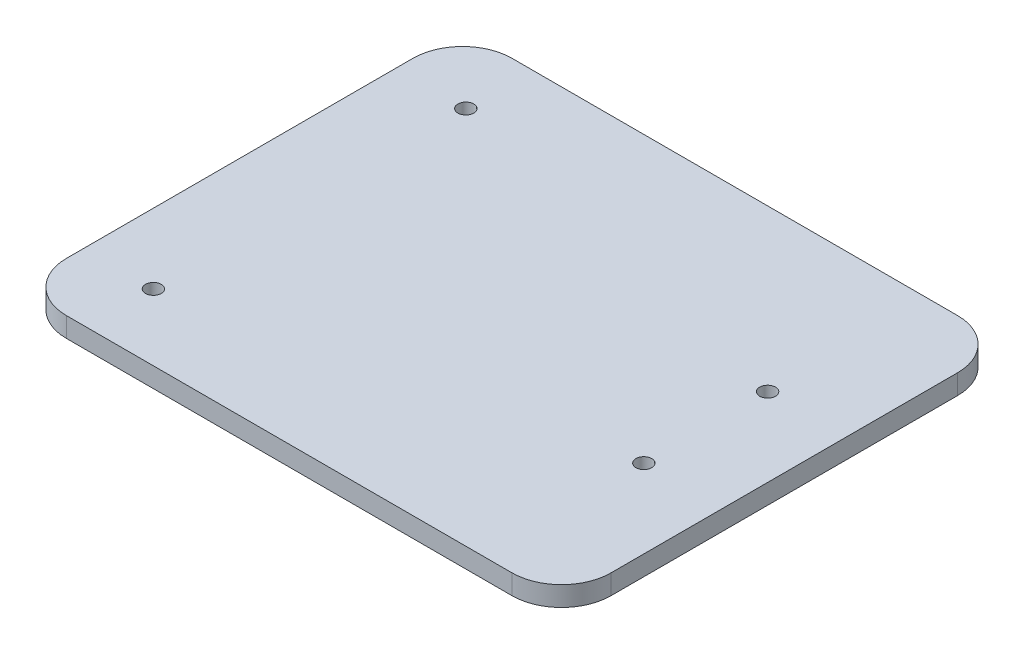
ISO-10303-21;
HEADER;
FILE_DESCRIPTION(('STEP AP214'),'2;1');
FILE_NAME('part.step','',(''),(''),'','','');
FILE_SCHEMA(('AUTOMOTIVE_DESIGN { 1 0 10303 214 1 1 1 1 }'));
ENDSEC;
DATA;
#1=APPLICATION_CONTEXT('core data for automotive mechanical design processes');
#2=APPLICATION_PROTOCOL_DEFINITION('international standard','automotive_design',2000,#1);
#3=PRODUCT_CONTEXT('',#1,'mechanical');
#4=PRODUCT('Part','Part','',(#3));
#5=PRODUCT_RELATED_PRODUCT_CATEGORY('part','',(#4));
#6=PRODUCT_DEFINITION_FORMATION('','',#4);
#7=PRODUCT_DEFINITION_CONTEXT('part definition',#1,'design');
#8=PRODUCT_DEFINITION('design','',#6,#7);
#9=PRODUCT_DEFINITION_SHAPE('','',#8);
#10=(LENGTH_UNIT() NAMED_UNIT(*) SI_UNIT(.MILLI.,.METRE.));
#11=(NAMED_UNIT(*) PLANE_ANGLE_UNIT() SI_UNIT($,.RADIAN.));
#12=(NAMED_UNIT(*) SI_UNIT($,.STERADIAN.) SOLID_ANGLE_UNIT());
#13=UNCERTAINTY_MEASURE_WITH_UNIT(LENGTH_MEASURE(1.E-05),#10,'distance_accuracy_value','');
#14=(GEOMETRIC_REPRESENTATION_CONTEXT(3) GLOBAL_UNCERTAINTY_ASSIGNED_CONTEXT((#13)) GLOBAL_UNIT_ASSIGNED_CONTEXT((#10,
#11,#12)) REPRESENTATION_CONTEXT('',''));
#15=CARTESIAN_POINT('',(0.,0.,0.));
#16=DIRECTION('',(0.,0.,1.));
#17=DIRECTION('',(1.,0.,0.));
#18=AXIS2_PLACEMENT_3D('',#15,#16,#17);
#19=CARTESIAN_POINT('',(-37.6983852204907,4.,-37.135142537582));
#20=DIRECTION('',(1.,0.,0.));
#21=DIRECTION('',(0.,0.,-1.));
#22=AXIS2_PLACEMENT_3D('',#19,#20,#21);
#23=PLANE('',#22);
#24=DIRECTION('',(0.,0.,1.));
#25=VECTOR('',#24,1.);
#26=CARTESIAN_POINT('',(-37.6983852204907,4.,-37.135142537582));
#27=LINE('',#26,#25);
#28=CARTESIAN_POINT('',(-37.6983852204907,4.,-27.135142537582));
#29=VERTEX_POINT('',#28);
#30=CARTESIAN_POINT('',(-37.6983852204907,4.,42.8648574624179));
#31=VERTEX_POINT('',#30);
#32=EDGE_CURVE('E122',#29,#31,#27,.T.);
#33=ORIENTED_EDGE('',*,*,#32,.F.);
#34=DIRECTION('',(0.,-1.,0.));
#35=VECTOR('',#34,1.);
#36=CARTESIAN_POINT('',(-37.6983852204907,4.,-27.135142537582));
#37=LINE('',#36,#35);
#38=CARTESIAN_POINT('',(-37.6983852204907,0.,-27.135142537582));
#39=VERTEX_POINT('',#38);
#40=EDGE_CURVE('E107',#29,#39,#37,.T.);
#41=ORIENTED_EDGE('',*,*,#40,.T.);
#42=DIRECTION('',(0.,0.,1.));
#43=VECTOR('',#42,1.);
#44=CARTESIAN_POINT('',(-37.6983852204907,0.,-37.135142537582));
#45=LINE('',#44,#43);
#46=CARTESIAN_POINT('',(-37.6983852204907,0.,42.8648574624179));
#47=VERTEX_POINT('',#46);
#48=EDGE_CURVE('E119',#39,#47,#45,.T.);
#49=ORIENTED_EDGE('',*,*,#48,.T.);
#50=DIRECTION('',(0.,-1.,0.));
#51=VECTOR('',#50,1.);
#52=CARTESIAN_POINT('',(-37.6983852204907,4.,42.8648574624179));
#53=LINE('',#52,#51);
#54=EDGE_CURVE('E124',#47,#31,#53,.F.);
#55=ORIENTED_EDGE('',*,*,#54,.T.);
#56=EDGE_LOOP('',(#33,#41,#49,#55));
#57=FACE_BOUND('',#56,.T.);
#58=ADVANCED_FACE('F37',(#57),#23,.F.);
#59=CARTESIAN_POINT('',(-37.6983852204907,4.,52.8648574624179));
#60=DIRECTION('',(0.,0.,-1.));
#61=DIRECTION('',(-1.,0.,0.));
#62=AXIS2_PLACEMENT_3D('',#59,#60,#61);
#63=PLANE('',#62);
#64=DIRECTION('',(1.,0.,0.));
#65=VECTOR('',#64,1.);
#66=CARTESIAN_POINT('',(-37.6983852204907,0.,52.8648574624179));
#67=LINE('',#66,#65);
#68=CARTESIAN_POINT('',(-27.6983852204907,0.,52.8648574624179));
#69=VERTEX_POINT('',#68);
#70=CARTESIAN_POINT('',(62.3016147795094,0.,52.8648574624179));
#71=VERTEX_POINT('',#70);
#72=EDGE_CURVE('E128',#69,#71,#67,.T.);
#73=ORIENTED_EDGE('',*,*,#72,.T.);
#74=DIRECTION('',(0.,-1.,0.));
#75=VECTOR('',#74,1.);
#76=CARTESIAN_POINT('',(62.3016147795094,4.,52.8648574624179));
#77=LINE('',#76,#75);
#78=CARTESIAN_POINT('',(62.3016147795094,4.,52.8648574624179));
#79=VERTEX_POINT('',#78);
#80=EDGE_CURVE('E11',#71,#79,#77,.F.);
#81=ORIENTED_EDGE('',*,*,#80,.T.);
#82=DIRECTION('',(1.,0.,0.));
#83=VECTOR('',#82,1.);
#84=CARTESIAN_POINT('',(-37.6983852204907,4.,52.8648574624179));
#85=LINE('',#84,#83);
#86=CARTESIAN_POINT('',(-27.6983852204907,4.,52.8648574624179));
#87=VERTEX_POINT('',#86);
#88=EDGE_CURVE('E168',#87,#79,#85,.T.);
#89=ORIENTED_EDGE('',*,*,#88,.F.);
#90=DIRECTION('',(0.,-1.,0.));
#91=VECTOR('',#90,1.);
#92=CARTESIAN_POINT('',(-27.6983852204907,4.,52.8648574624179));
#93=LINE('',#92,#91);
#94=EDGE_CURVE('E45',#87,#69,#93,.T.);
#95=ORIENTED_EDGE('',*,*,#94,.T.);
#96=EDGE_LOOP('',(#73,#81,#89,#95));
#97=FACE_BOUND('',#96,.T.);
#98=ADVANCED_FACE('F166',(#97),#63,.F.);
#99=CARTESIAN_POINT('',(72.3016147795093,4.,-37.135142537582));
#100=DIRECTION('',(-1.,0.,0.));
#101=DIRECTION('',(0.,0.,1.));
#102=AXIS2_PLACEMENT_3D('',#99,#100,#101);
#103=PLANE('',#102);
#104=DIRECTION('',(0.,0.,-1.));
#105=VECTOR('',#104,1.);
#106=CARTESIAN_POINT('',(72.3016147795093,0.,-37.135142537582));
#107=LINE('',#106,#105);
#108=CARTESIAN_POINT('',(72.3016147795094,0.,42.8648574624179));
#109=VERTEX_POINT('',#108);
#110=CARTESIAN_POINT('',(72.3016147795093,0.,-27.1351425375821));
#111=VERTEX_POINT('',#110);
#112=EDGE_CURVE('E132',#109,#111,#107,.T.);
#113=ORIENTED_EDGE('',*,*,#112,.T.);
#114=DIRECTION('',(0.,-1.,0.));
#115=VECTOR('',#114,1.);
#116=CARTESIAN_POINT('',(72.3016147795093,4.,-27.1351425375821));
#117=LINE('',#116,#115);
#118=CARTESIAN_POINT('',(72.3016147795093,4.,-27.1351425375821));
#119=VERTEX_POINT('',#118);
#120=EDGE_CURVE('E52',#111,#119,#117,.F.);
#121=ORIENTED_EDGE('',*,*,#120,.T.);
#122=DIRECTION('',(0.,0.,-1.));
#123=VECTOR('',#122,1.);
#124=CARTESIAN_POINT('',(72.3016147795093,4.,-37.135142537582));
#125=LINE('',#124,#123);
#126=CARTESIAN_POINT('',(72.3016147795094,4.,42.8648574624179));
#127=VERTEX_POINT('',#126);
#128=EDGE_CURVE('E176',#127,#119,#125,.T.);
#129=ORIENTED_EDGE('',*,*,#128,.F.);
#130=DIRECTION('',(0.,-1.,0.));
#131=VECTOR('',#130,1.);
#132=CARTESIAN_POINT('',(72.3016147795094,4.,42.8648574624179));
#133=LINE('',#132,#131);
#134=EDGE_CURVE('E159',#127,#109,#133,.T.);
#135=ORIENTED_EDGE('',*,*,#134,.T.);
#136=EDGE_LOOP('',(#113,#121,#129,#135));
#137=FACE_BOUND('',#136,.T.);
#138=ADVANCED_FACE('F175',(#137),#103,.F.);
#139=CARTESIAN_POINT('',(-37.6983852204907,4.,-37.135142537582));
#140=DIRECTION('',(0.,0.,1.));
#141=DIRECTION('',(1.,0.,0.));
#142=AXIS2_PLACEMENT_3D('',#139,#140,#141);
#143=PLANE('',#142);
#144=DIRECTION('',(-1.,0.,0.));
#145=VECTOR('',#144,1.);
#146=CARTESIAN_POINT('',(-37.6983852204907,0.,-37.135142537582));
#147=LINE('',#146,#145);
#148=CARTESIAN_POINT('',(62.3016147795093,0.,-37.135142537582));
#149=VERTEX_POINT('',#148);
#150=CARTESIAN_POINT('',(-27.6983852204907,0.,-37.135142537582));
#151=VERTEX_POINT('',#150);
#152=EDGE_CURVE('E142',#149,#151,#147,.T.);
#153=ORIENTED_EDGE('',*,*,#152,.T.);
#154=DIRECTION('',(0.,-1.,0.));
#155=VECTOR('',#154,1.);
#156=CARTESIAN_POINT('',(-27.6983852204907,4.,-37.135142537582));
#157=LINE('',#156,#155);
#158=CARTESIAN_POINT('',(-27.6983852204907,4.,-37.135142537582));
#159=VERTEX_POINT('',#158);
#160=EDGE_CURVE('E108',#151,#159,#157,.F.);
#161=ORIENTED_EDGE('',*,*,#160,.T.);
#162=DIRECTION('',(-1.,0.,0.));
#163=VECTOR('',#162,1.);
#164=CARTESIAN_POINT('',(-37.6983852204907,4.,-37.135142537582));
#165=LINE('',#164,#163);
#166=CARTESIAN_POINT('',(62.3016147795093,4.,-37.135142537582));
#167=VERTEX_POINT('',#166);
#168=EDGE_CURVE('E138',#167,#159,#165,.T.);
#169=ORIENTED_EDGE('',*,*,#168,.F.);
#170=DIRECTION('',(0.,-1.,0.));
#171=VECTOR('',#170,1.);
#172=CARTESIAN_POINT('',(62.3016147795093,4.,-37.135142537582));
#173=LINE('',#172,#171);
#174=EDGE_CURVE('E113',#167,#149,#173,.T.);
#175=ORIENTED_EDGE('',*,*,#174,.T.);
#176=EDGE_LOOP('',(#153,#161,#169,#175));
#177=FACE_BOUND('',#176,.T.);
#178=ADVANCED_FACE('F208',(#177),#143,.F.);
#179=CARTESIAN_POINT('',(0.,4.,0.));
#180=DIRECTION('',(0.,1.,0.));
#181=DIRECTION('',(0.,0.,1.));
#182=AXIS2_PLACEMENT_3D('',#179,#180,#181);
#183=PLANE('',#182);
#184=CARTESIAN_POINT('',(-23.5738514825679,4.,-23.6851425375821));
#185=DIRECTION('',(0.,1.,0.));
#186=DIRECTION('',(0.,0.,1.));
#187=AXIS2_PLACEMENT_3D('',#184,#185,#186);
#188=CIRCLE('',#187,1.6);
#189=CARTESIAN_POINT('',(-23.5738514825679,4.,-22.0851425375821));
#190=VERTEX_POINT('',#189);
#191=EDGE_CURVE('E135',#190,#190,#188,.T.);
#192=ORIENTED_EDGE('',*,*,#191,.F.);
#193=EDGE_LOOP('',(#192));
#194=FACE_BOUND('',#193,.T.);
#195=CARTESIAN_POINT('',(56.4261485174321,4.,-4.63514253758207));
#196=DIRECTION('',(0.,1.,0.));
#197=DIRECTION('',(0.,0.,1.));
#198=AXIS2_PLACEMENT_3D('',#195,#196,#197);
#199=CIRCLE('',#198,1.6);
#200=CARTESIAN_POINT('',(56.4261485174321,4.,-3.03514253758208));
#201=VERTEX_POINT('',#200);
#202=EDGE_CURVE('E197',#201,#201,#199,.T.);
#203=ORIENTED_EDGE('',*,*,#202,.F.);
#204=EDGE_LOOP('',(#203));
#205=FACE_BOUND('',#204,.T.);
#206=CARTESIAN_POINT('',(56.4261485174321,4.,20.3648574624179));
#207=DIRECTION('',(0.,1.,0.));
#208=DIRECTION('',(0.,0.,1.));
#209=AXIS2_PLACEMENT_3D('',#206,#207,#208);
#210=CIRCLE('',#209,1.6);
#211=CARTESIAN_POINT('',(56.4261485174321,4.,21.9648574624179));
#212=VERTEX_POINT('',#211);
#213=EDGE_CURVE('E191',#212,#212,#210,.T.);
#214=ORIENTED_EDGE('',*,*,#213,.F.);
#215=EDGE_LOOP('',(#214));
#216=FACE_BOUND('',#215,.T.);
#217=CARTESIAN_POINT('',(-23.5738514825679,4.,39.4148574624179));
#218=DIRECTION('',(0.,1.,0.));
#219=DIRECTION('',(0.,0.,1.));
#220=AXIS2_PLACEMENT_3D('',#217,#218,#219);
#221=CIRCLE('',#220,1.6);
#222=CARTESIAN_POINT('',(-23.5738514825679,4.,41.0148574624179));
#223=VERTEX_POINT('',#222);
#224=EDGE_CURVE('E185',#223,#223,#221,.T.);
#225=ORIENTED_EDGE('',*,*,#224,.F.);
#226=EDGE_LOOP('',(#225));
#227=FACE_BOUND('',#226,.T.);
#228=ORIENTED_EDGE('',*,*,#168,.T.);
#229=CARTESIAN_POINT('',(-27.6983852204907,4.,-27.135142537582));
#230=DIRECTION('',(0.,1.,0.));
#231=DIRECTION('',(0.,0.,1.));
#232=AXIS2_PLACEMENT_3D('',#229,#230,#231);
#233=CIRCLE('',#232,10.);
#234=EDGE_CURVE('E157',#159,#29,#233,.T.);
#235=ORIENTED_EDGE('',*,*,#234,.T.);
#236=ORIENTED_EDGE('',*,*,#32,.T.);
#237=CARTESIAN_POINT('',(-27.6983852204907,4.,42.8648574624179));
#238=DIRECTION('',(0.,1.,0.));
#239=DIRECTION('',(0.,0.,1.));
#240=AXIS2_PLACEMENT_3D('',#237,#238,#239);
#241=CIRCLE('',#240,10.);
#242=EDGE_CURVE('E152',#31,#87,#241,.T.);
#243=ORIENTED_EDGE('',*,*,#242,.T.);
#244=ORIENTED_EDGE('',*,*,#88,.T.);
#245=CARTESIAN_POINT('',(62.3016147795094,4.,42.8648574624179));
#246=DIRECTION('',(0.,1.,0.));
#247=DIRECTION('',(0.,0.,1.));
#248=AXIS2_PLACEMENT_3D('',#245,#246,#247);
#249=CIRCLE('',#248,10.);
#250=EDGE_CURVE('E59',#79,#127,#249,.T.);
#251=ORIENTED_EDGE('',*,*,#250,.T.);
#252=ORIENTED_EDGE('',*,*,#128,.T.);
#253=CARTESIAN_POINT('',(62.3016147795093,4.,-27.135142537582));
#254=DIRECTION('',(0.,1.,0.));
#255=DIRECTION('',(0.,0.,1.));
#256=AXIS2_PLACEMENT_3D('',#253,#254,#255);
#257=CIRCLE('',#256,10.);
#258=EDGE_CURVE('E155',#119,#167,#257,.T.);
#259=ORIENTED_EDGE('',*,*,#258,.T.);
#260=EDGE_LOOP('',(#228,#235,#236,#243,#244,#251,#252,#259));
#261=FACE_BOUND('',#260,.T.);
#262=ADVANCED_FACE('F205',(#194,#205,#216,#227,#261),#183,.T.);
#263=CARTESIAN_POINT('',(0.,0.,0.));
#264=DIRECTION('',(0.,1.,0.));
#265=DIRECTION('',(0.,0.,1.));
#266=AXIS2_PLACEMENT_3D('',#263,#264,#265);
#267=PLANE('',#266);
#268=CARTESIAN_POINT('',(-23.5738514825679,0.,-23.6851425375821));
#269=DIRECTION('',(0.,1.,0.));
#270=DIRECTION('',(0.,0.,1.));
#271=AXIS2_PLACEMENT_3D('',#268,#269,#270);
#272=CIRCLE('',#271,1.6);
#273=CARTESIAN_POINT('',(-23.5738514825679,0.,-22.0851425375821));
#274=VERTEX_POINT('',#273);
#275=EDGE_CURVE('E129',#274,#274,#272,.T.);
#276=ORIENTED_EDGE('',*,*,#275,.T.);
#277=EDGE_LOOP('',(#276));
#278=FACE_BOUND('',#277,.T.);
#279=CARTESIAN_POINT('',(56.4261485174321,0.,-4.63514253758207));
#280=DIRECTION('',(0.,1.,0.));
#281=DIRECTION('',(0.,0.,1.));
#282=AXIS2_PLACEMENT_3D('',#279,#280,#281);
#283=CIRCLE('',#282,1.6);
#284=CARTESIAN_POINT('',(56.4261485174321,0.,-3.03514253758208));
#285=VERTEX_POINT('',#284);
#286=EDGE_CURVE('E194',#285,#285,#283,.T.);
#287=ORIENTED_EDGE('',*,*,#286,.T.);
#288=EDGE_LOOP('',(#287));
#289=FACE_BOUND('',#288,.T.);
#290=CARTESIAN_POINT('',(56.4261485174321,0.,20.3648574624179));
#291=DIRECTION('',(0.,1.,0.));
#292=DIRECTION('',(0.,0.,1.));
#293=AXIS2_PLACEMENT_3D('',#290,#291,#292);
#294=CIRCLE('',#293,1.6);
#295=CARTESIAN_POINT('',(56.4261485174321,0.,21.9648574624179));
#296=VERTEX_POINT('',#295);
#297=EDGE_CURVE('E188',#296,#296,#294,.T.);
#298=ORIENTED_EDGE('',*,*,#297,.T.);
#299=EDGE_LOOP('',(#298));
#300=FACE_BOUND('',#299,.T.);
#301=CARTESIAN_POINT('',(-23.5738514825679,0.,39.4148574624179));
#302=DIRECTION('',(0.,1.,0.));
#303=DIRECTION('',(0.,0.,1.));
#304=AXIS2_PLACEMENT_3D('',#301,#302,#303);
#305=CIRCLE('',#304,1.6);
#306=CARTESIAN_POINT('',(-23.5738514825679,0.,41.0148574624179));
#307=VERTEX_POINT('',#306);
#308=EDGE_CURVE('E182',#307,#307,#305,.T.);
#309=ORIENTED_EDGE('',*,*,#308,.T.);
#310=EDGE_LOOP('',(#309));
#311=FACE_BOUND('',#310,.T.);
#312=ORIENTED_EDGE('',*,*,#48,.F.);
#313=CARTESIAN_POINT('',(-27.6983852204907,0.,-27.135142537582));
#314=DIRECTION('',(0.,1.,0.));
#315=DIRECTION('',(0.,0.,1.));
#316=AXIS2_PLACEMENT_3D('',#313,#314,#315);
#317=CIRCLE('',#316,10.);
#318=EDGE_CURVE('E103',#39,#151,#317,.F.);
#319=ORIENTED_EDGE('',*,*,#318,.T.);
#320=ORIENTED_EDGE('',*,*,#152,.F.);
#321=CARTESIAN_POINT('',(62.3016147795093,0.,-27.135142537582));
#322=DIRECTION('',(0.,1.,0.));
#323=DIRECTION('',(0.,0.,1.));
#324=AXIS2_PLACEMENT_3D('',#321,#322,#323);
#325=CIRCLE('',#324,10.);
#326=EDGE_CURVE('E114',#149,#111,#325,.F.);
#327=ORIENTED_EDGE('',*,*,#326,.T.);
#328=ORIENTED_EDGE('',*,*,#112,.F.);
#329=CARTESIAN_POINT('',(62.3016147795094,0.,42.8648574624179));
#330=DIRECTION('',(0.,1.,0.));
#331=DIRECTION('',(0.,0.,1.));
#332=AXIS2_PLACEMENT_3D('',#329,#330,#331);
#333=CIRCLE('',#332,10.);
#334=EDGE_CURVE('E146',#109,#71,#333,.F.);
#335=ORIENTED_EDGE('',*,*,#334,.T.);
#336=ORIENTED_EDGE('',*,*,#72,.F.);
#337=CARTESIAN_POINT('',(-27.6983852204907,0.,42.8648574624179));
#338=DIRECTION('',(0.,1.,0.));
#339=DIRECTION('',(0.,0.,1.));
#340=AXIS2_PLACEMENT_3D('',#337,#338,#339);
#341=CIRCLE('',#340,10.);
#342=EDGE_CURVE('E123',#69,#47,#341,.F.);
#343=ORIENTED_EDGE('',*,*,#342,.T.);
#344=EDGE_LOOP('',(#312,#319,#320,#327,#328,#335,#336,#343));
#345=FACE_BOUND('',#344,.T.);
#346=ADVANCED_FACE('F126',(#278,#289,#300,#311,#345),#267,.F.);
#347=CARTESIAN_POINT('',(-27.6983852204907,4.,-27.135142537582));
#348=DIRECTION('',(0.,-1.,0.));
#349=DIRECTION('',(0.,0.,-1.));
#350=AXIS2_PLACEMENT_3D('',#347,#348,#349);
#351=CYLINDRICAL_SURFACE('',#350,10.);
#352=ORIENTED_EDGE('',*,*,#234,.F.);
#353=ORIENTED_EDGE('',*,*,#160,.F.);
#354=ORIENTED_EDGE('',*,*,#318,.F.);
#355=ORIENTED_EDGE('',*,*,#40,.F.);
#356=EDGE_LOOP('',(#352,#353,#354,#355));
#357=FACE_BOUND('',#356,.T.);
#358=ADVANCED_FACE('F106',(#357),#351,.T.);
#359=CARTESIAN_POINT('',(62.3016147795093,4.,-27.135142537582));
#360=DIRECTION('',(0.,-1.,0.));
#361=DIRECTION('',(0.,0.,-1.));
#362=AXIS2_PLACEMENT_3D('',#359,#360,#361);
#363=CYLINDRICAL_SURFACE('',#362,10.);
#364=ORIENTED_EDGE('',*,*,#258,.F.);
#365=ORIENTED_EDGE('',*,*,#120,.F.);
#366=ORIENTED_EDGE('',*,*,#326,.F.);
#367=ORIENTED_EDGE('',*,*,#174,.F.);
#368=EDGE_LOOP('',(#364,#365,#366,#367));
#369=FACE_BOUND('',#368,.T.);
#370=ADVANCED_FACE('F219',(#369),#363,.T.);
#371=CARTESIAN_POINT('',(62.3016147795094,4.,42.8648574624179));
#372=DIRECTION('',(0.,-1.,0.));
#373=DIRECTION('',(0.,0.,-1.));
#374=AXIS2_PLACEMENT_3D('',#371,#372,#373);
#375=CYLINDRICAL_SURFACE('',#374,10.);
#376=ORIENTED_EDGE('',*,*,#250,.F.);
#377=ORIENTED_EDGE('',*,*,#80,.F.);
#378=ORIENTED_EDGE('',*,*,#334,.F.);
#379=ORIENTED_EDGE('',*,*,#134,.F.);
#380=EDGE_LOOP('',(#376,#377,#378,#379));
#381=FACE_BOUND('',#380,.T.);
#382=ADVANCED_FACE('F174',(#381),#375,.T.);
#383=CARTESIAN_POINT('',(-27.6983852204907,4.,42.8648574624179));
#384=DIRECTION('',(0.,-1.,0.));
#385=DIRECTION('',(0.,0.,-1.));
#386=AXIS2_PLACEMENT_3D('',#383,#384,#385);
#387=CYLINDRICAL_SURFACE('',#386,10.);
#388=ORIENTED_EDGE('',*,*,#242,.F.);
#389=ORIENTED_EDGE('',*,*,#54,.F.);
#390=ORIENTED_EDGE('',*,*,#342,.F.);
#391=ORIENTED_EDGE('',*,*,#94,.F.);
#392=EDGE_LOOP('',(#388,#389,#390,#391));
#393=FACE_BOUND('',#392,.T.);
#394=ADVANCED_FACE('F39',(#393),#387,.T.);
#395=CARTESIAN_POINT('',(-23.5738514825679,0.,39.4148574624179));
#396=DIRECTION('',(0.,1.,0.));
#397=DIRECTION('',(0.,0.,1.));
#398=AXIS2_PLACEMENT_3D('',#395,#396,#397);
#399=CYLINDRICAL_SURFACE('',#398,1.6);
#400=ORIENTED_EDGE('',*,*,#308,.F.);
#401=EDGE_LOOP('',(#400));
#402=FACE_BOUND('',#401,.T.);
#403=ORIENTED_EDGE('',*,*,#224,.T.);
#404=EDGE_LOOP('',(#403));
#405=FACE_BOUND('',#404,.T.);
#406=ADVANCED_FACE('F241',(#402,#405),#399,.F.);
#407=CARTESIAN_POINT('',(56.4261485174321,0.,20.3648574624179));
#408=DIRECTION('',(0.,1.,0.));
#409=DIRECTION('',(0.,0.,1.));
#410=AXIS2_PLACEMENT_3D('',#407,#408,#409);
#411=CYLINDRICAL_SURFACE('',#410,1.6);
#412=ORIENTED_EDGE('',*,*,#297,.F.);
#413=EDGE_LOOP('',(#412));
#414=FACE_BOUND('',#413,.T.);
#415=ORIENTED_EDGE('',*,*,#213,.T.);
#416=EDGE_LOOP('',(#415));
#417=FACE_BOUND('',#416,.T.);
#418=ADVANCED_FACE('F244',(#414,#417),#411,.F.);
#419=CARTESIAN_POINT('',(56.4261485174321,0.,-4.63514253758207));
#420=DIRECTION('',(0.,1.,0.));
#421=DIRECTION('',(0.,0.,1.));
#422=AXIS2_PLACEMENT_3D('',#419,#420,#421);
#423=CYLINDRICAL_SURFACE('',#422,1.6);
#424=ORIENTED_EDGE('',*,*,#286,.F.);
#425=EDGE_LOOP('',(#424));
#426=FACE_BOUND('',#425,.T.);
#427=ORIENTED_EDGE('',*,*,#202,.T.);
#428=EDGE_LOOP('',(#427));
#429=FACE_BOUND('',#428,.T.);
#430=ADVANCED_FACE('F248',(#426,#429),#423,.F.);
#431=CARTESIAN_POINT('',(-23.5738514825679,0.,-23.6851425375821));
#432=DIRECTION('',(0.,1.,0.));
#433=DIRECTION('',(0.,0.,1.));
#434=AXIS2_PLACEMENT_3D('',#431,#432,#433);
#435=CYLINDRICAL_SURFACE('',#434,1.6);
#436=ORIENTED_EDGE('',*,*,#275,.F.);
#437=EDGE_LOOP('',(#436));
#438=FACE_BOUND('',#437,.T.);
#439=ORIENTED_EDGE('',*,*,#191,.T.);
#440=EDGE_LOOP('',(#439));
#441=FACE_BOUND('',#440,.T.);
#442=ADVANCED_FACE('F203',(#438,#441),#435,.F.);
#443=CLOSED_SHELL('',(#58,#98,#138,#178,#262,#346,#358,#370,#382,#394,#406,#418,#430,#442));
#444=MANIFOLD_SOLID_BREP('B2',#443);
#445=ADVANCED_BREP_SHAPE_REPRESENTATION('',(#18,#444),#14);
#446=SHAPE_DEFINITION_REPRESENTATION(#9,#445);
ENDSEC;
END-ISO-10303-21;
